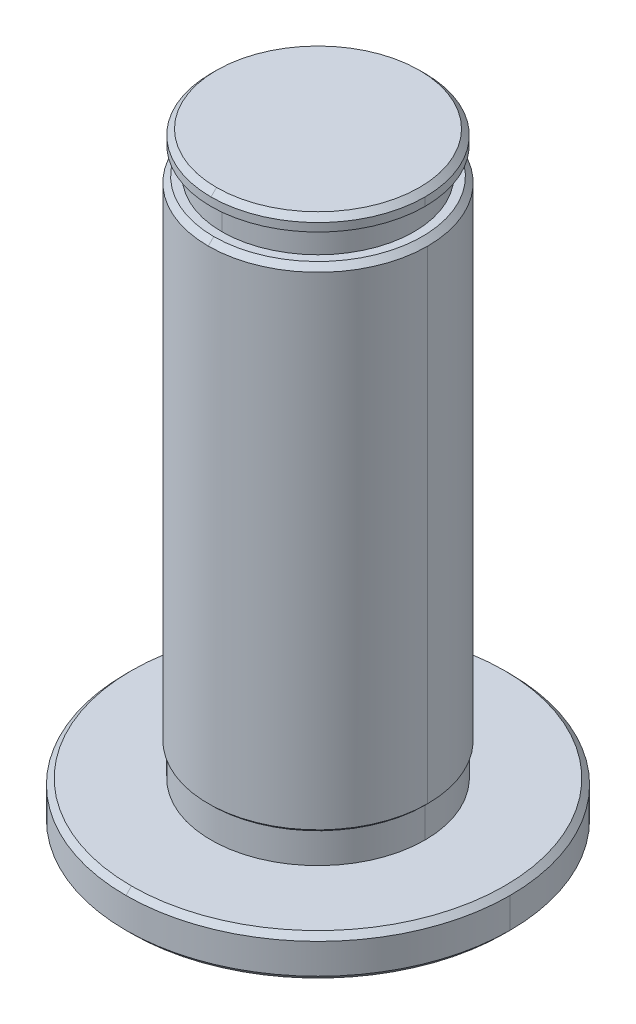
ISO-10303-21;
HEADER;
FILE_DESCRIPTION(('STEP AP214'),'2;1');
FILE_NAME('part.step','',(''),(''),'','','');
FILE_SCHEMA(('AUTOMOTIVE_DESIGN { 1 0 10303 214 1 1 1 1 }'));
ENDSEC;
DATA;
#1=APPLICATION_CONTEXT('core data for automotive mechanical design processes');
#2=APPLICATION_PROTOCOL_DEFINITION('international standard','automotive_design',2000,#1);
#3=PRODUCT_CONTEXT('',#1,'mechanical');
#4=PRODUCT('Part','Part','',(#3));
#5=PRODUCT_RELATED_PRODUCT_CATEGORY('part','',(#4));
#6=PRODUCT_DEFINITION_FORMATION('','',#4);
#7=PRODUCT_DEFINITION_CONTEXT('part definition',#1,'design');
#8=PRODUCT_DEFINITION('design','',#6,#7);
#9=PRODUCT_DEFINITION_SHAPE('','',#8);
#10=(LENGTH_UNIT() NAMED_UNIT(*) SI_UNIT(.MILLI.,.METRE.));
#11=(NAMED_UNIT(*) PLANE_ANGLE_UNIT() SI_UNIT($,.RADIAN.));
#12=(NAMED_UNIT(*) SI_UNIT($,.STERADIAN.) SOLID_ANGLE_UNIT());
#13=UNCERTAINTY_MEASURE_WITH_UNIT(LENGTH_MEASURE(1.E-05),#10,'distance_accuracy_value','');
#14=(GEOMETRIC_REPRESENTATION_CONTEXT(3) GLOBAL_UNCERTAINTY_ASSIGNED_CONTEXT((#13)) GLOBAL_UNIT_ASSIGNED_CONTEXT((#10,
#11,#12)) REPRESENTATION_CONTEXT('',''));
#15=CARTESIAN_POINT('',(0.,0.,0.));
#16=DIRECTION('',(0.,0.,1.));
#17=DIRECTION('',(1.,0.,0.));
#18=AXIS2_PLACEMENT_3D('',#15,#16,#17);
#19=CARTESIAN_POINT('',(0.,22.3999999999,-1.727211490668E-09));
#20=DIRECTION('',(0.,-1.,0.));
#21=DIRECTION('',(0.,0.,-1.));
#22=AXIS2_PLACEMENT_3D('',#19,#20,#21);
#23=CONICAL_SURFACE('',#22,3.800000001147,0.78539816335262);
#24=DIRECTION('',(-1.017767324438E-09,0.707106780865698,-0.707106781507398));
#25=VECTOR('',#24,1.);
#26=CARTESIAN_POINT('',(2.878682977538E-10,22.29999999991,3.899999999601));
#27=LINE('',#26,#25);
#28=CARTESIAN_POINT('',(8.636039379043E-10,22.29999999991,3.899999999401));
#29=VERTEX_POINT('',#28);
#30=CARTESIAN_POINT('',(0.,22.5,3.699999999331));
#31=VERTEX_POINT('',#30);
#32=EDGE_CURVE('E75',#29,#31,#27,.T.);
#33=ORIENTED_EDGE('',*,*,#32,.F.);
#34=CARTESIAN_POINT('',(0.,22.29999999991,-1.727211490668E-09));
#35=DIRECTION('',(0.,-1.,0.));
#36=DIRECTION('',(1.,0.,4.428749861263E-10));
#37=AXIS2_PLACEMENT_3D('',#34,#35,#36);
#38=CIRCLE('',#37,3.900000001129);
#39=CARTESIAN_POINT('',(3.900000000001,22.30000000104,-2.878681292819E-10));
#40=VERTEX_POINT('',#39);
#41=EDGE_CURVE('E79',#40,#29,#38,.T.);
#42=ORIENTED_EDGE('',*,*,#41,.F.);
#43=CARTESIAN_POINT('',(0.,22.30000000216,-1.727211490668E-09));
#44=DIRECTION('',(0.,-1.,0.));
#45=DIRECTION('',(2.214375963056E-10,0.,-1.));
#46=AXIS2_PLACEMENT_3D('',#43,#44,#45);
#47=CIRCLE('',#46,3.899999998878);
#48=CARTESIAN_POINT('',(8.636066253432E-10,22.30000000216,-3.900000000605));
#49=VERTEX_POINT('',#48);
#50=EDGE_CURVE('E104',#49,#40,#47,.T.);
#51=ORIENTED_EDGE('',*,*,#50,.F.);
#52=DIRECTION('',(-1.017769855889E-09,0.707106781575398,0.707106780797698));
#53=VECTOR('',#52,1.);
#54=CARTESIAN_POINT('',(2.878685566616E-10,22.30000000216,-3.900000000403));
#55=LINE('',#54,#53);
#56=CARTESIAN_POINT('',(0.,22.5,-3.700000002785));
#57=VERTEX_POINT('',#56);
#58=EDGE_CURVE('E84',#49,#57,#55,.T.);
#59=ORIENTED_EDGE('',*,*,#58,.T.);
#60=CARTESIAN_POINT('',(0.,22.5,-1.727211490668E-09));
#61=DIRECTION('',(0.,-1.,0.));
#62=DIRECTION('',(0.,0.,-1.));
#63=AXIS2_PLACEMENT_3D('',#60,#61,#62);
#64=CIRCLE('',#63,3.700000001058);
#65=EDGE_CURVE('E9',#57,#31,#64,.T.);
#66=ORIENTED_EDGE('',*,*,#65,.T.);
#67=EDGE_LOOP('',(#33,#42,#51,#59,#66));
#68=FACE_BOUND('',#67,.T.);
#69=ADVANCED_FACE('F15',(#68),#23,.T.);
#70=CARTESIAN_POINT('',(0.,22.5,0.));
#71=DIRECTION('',(0.,1.,0.));
#72=DIRECTION('',(1.,0.,0.));
#73=AXIS2_PLACEMENT_3D('',#70,#71,#72);
#74=PLANE('',#73);
#75=CARTESIAN_POINT('',(0.,22.5,-1.727211490668E-09));
#76=DIRECTION('',(0.,-1.,0.));
#77=DIRECTION('',(0.,0.,1.));
#78=AXIS2_PLACEMENT_3D('',#75,#76,#77);
#79=CIRCLE('',#78,3.700000001058);
#80=EDGE_CURVE('E24',#31,#57,#79,.T.);
#81=ORIENTED_EDGE('',*,*,#80,.F.);
#82=ORIENTED_EDGE('',*,*,#65,.F.);
#83=EDGE_LOOP('',(#81,#82));
#84=FACE_BOUND('',#83,.T.);
#85=ADVANCED_FACE('F502',(#84),#74,.T.);
#86=CARTESIAN_POINT('',(0.,22.3999999999,-1.727211490668E-09));
#87=DIRECTION('',(0.,-1.,0.));
#88=DIRECTION('',(0.,0.,-1.));
#89=AXIS2_PLACEMENT_3D('',#86,#87,#88);
#90=CONICAL_SURFACE('',#89,3.800000001147,0.78539816335262);
#91=ORIENTED_EDGE('',*,*,#58,.F.);
#92=CARTESIAN_POINT('',(0.,22.30000000216,-1.727211490668E-09));
#93=DIRECTION('',(0.,-1.,0.));
#94=DIRECTION('',(-1.,0.,4.427493855751E-10));
#95=AXIS2_PLACEMENT_3D('',#92,#93,#94);
#96=CIRCLE('',#95,3.899999998878);
#97=CARTESIAN_POINT('',(-3.899999998878,22.30000000216,-4.88887422217E-13));
#98=VERTEX_POINT('',#97);
#99=EDGE_CURVE('E89',#98,#49,#96,.T.);
#100=ORIENTED_EDGE('',*,*,#99,.F.);
#101=CARTESIAN_POINT('',(0.,22.29999999991,-1.727211490668E-09));
#102=DIRECTION('',(0.,-1.,0.));
#103=DIRECTION('',(2.214369070909E-10,0.,1.));
#104=AXIS2_PLACEMENT_3D('',#101,#102,#103);
#105=CIRCLE('',#104,3.900000001129);
#106=EDGE_CURVE('E86',#29,#98,#105,.T.);
#107=ORIENTED_EDGE('',*,*,#106,.F.);
#108=ORIENTED_EDGE('',*,*,#32,.T.);
#109=ORIENTED_EDGE('',*,*,#80,.T.);
#110=EDGE_LOOP('',(#91,#100,#107,#108,#109));
#111=FACE_BOUND('',#110,.T.);
#112=ADVANCED_FACE('F87',(#111),#90,.T.);
#113=CARTESIAN_POINT('',(0.,-1.255,0.));
#114=DIRECTION('',(0.,1.,0.));
#115=DIRECTION('',(1.,0.,0.));
#116=AXIS2_PLACEMENT_3D('',#113,#114,#115);
#117=CYLINDRICAL_SURFACE('',#116,3.9);
#118=CARTESIAN_POINT('',(0.,21.99999999967,0.));
#119=DIRECTION('',(0.,1.,0.));
#120=DIRECTION('',(0.,0.,1.));
#121=AXIS2_PLACEMENT_3D('',#118,#119,#120);
#122=CIRCLE('',#121,3.9);
#123=CARTESIAN_POINT('',(0.,21.99999999967,3.9));
#124=VERTEX_POINT('',#123);
#125=CARTESIAN_POINT('',(3.9,21.99999999967,0.));
#126=VERTEX_POINT('',#125);
#127=EDGE_CURVE('E205',#124,#126,#122,.T.);
#128=ORIENTED_EDGE('',*,*,#127,.T.);
#129=DIRECTION('',(-3.367676492695E-12,-1.,9.595613552628E-10));
#130=VECTOR('',#129,1.);
#131=CARTESIAN_POINT('',(3.900000000001,22.30000000104,-2.878681292819E-10));
#132=LINE('',#131,#130);
#133=EDGE_CURVE('E96',#40,#126,#132,.T.);
#134=ORIENTED_EDGE('',*,*,#133,.F.);
#135=ORIENTED_EDGE('',*,*,#41,.T.);
#136=ORIENTED_EDGE('',*,*,#106,.T.);
#137=DIRECTION('',(3.367676492695E-12,-1.,9.595624836255E-10));
#138=VECTOR('',#137,1.);
#139=CARTESIAN_POINT('',(-3.900000000001,22.30000000104,-2.881946312147E-10));
#140=LINE('',#139,#138);
#141=CARTESIAN_POINT('',(-3.9,21.99999999967,0.));
#142=VERTEX_POINT('',#141);
#143=EDGE_CURVE('E172',#98,#142,#140,.T.);
#144=ORIENTED_EDGE('',*,*,#143,.T.);
#145=CARTESIAN_POINT('',(0.,21.99999999967,0.));
#146=DIRECTION('',(0.,1.,0.));
#147=DIRECTION('',(-1.,0.,0.));
#148=AXIS2_PLACEMENT_3D('',#145,#146,#147);
#149=CIRCLE('',#148,3.9);
#150=EDGE_CURVE('E208',#142,#124,#149,.T.);
#151=ORIENTED_EDGE('',*,*,#150,.T.);
#152=EDGE_LOOP('',(#128,#134,#135,#136,#144,#151));
#153=FACE_BOUND('',#152,.T.);
#154=ADVANCED_FACE('F95',(#153),#117,.T.);
#155=CARTESIAN_POINT('',(0.,-1.255,0.));
#156=DIRECTION('',(0.,1.,0.));
#157=DIRECTION('',(1.,0.,0.));
#158=AXIS2_PLACEMENT_3D('',#155,#156,#157);
#159=CYLINDRICAL_SURFACE('',#158,3.9);
#160=ORIENTED_EDGE('',*,*,#143,.F.);
#161=ORIENTED_EDGE('',*,*,#99,.T.);
#162=ORIENTED_EDGE('',*,*,#50,.T.);
#163=ORIENTED_EDGE('',*,*,#133,.T.);
#164=CARTESIAN_POINT('',(0.,21.99999999967,0.));
#165=DIRECTION('',(0.,1.,0.));
#166=DIRECTION('',(1.,0.,0.));
#167=AXIS2_PLACEMENT_3D('',#164,#165,#166);
#168=CIRCLE('',#167,3.9);
#169=CARTESIAN_POINT('',(0.,21.99999999967,-3.9));
#170=VERTEX_POINT('',#169);
#171=EDGE_CURVE('E175',#126,#170,#168,.T.);
#172=ORIENTED_EDGE('',*,*,#171,.T.);
#173=CARTESIAN_POINT('',(0.,21.99999999967,0.));
#174=DIRECTION('',(0.,1.,0.));
#175=DIRECTION('',(0.,0.,-1.));
#176=AXIS2_PLACEMENT_3D('',#173,#174,#175);
#177=CIRCLE('',#176,3.9);
#178=EDGE_CURVE('E211',#170,#142,#177,.T.);
#179=ORIENTED_EDGE('',*,*,#178,.T.);
#180=EDGE_LOOP('',(#160,#161,#162,#163,#172,#179));
#181=FACE_BOUND('',#180,.T.);
#182=ADVANCED_FACE('F513',(#181),#159,.T.);
#183=CARTESIAN_POINT('',(0.,21.99999999967,0.));
#184=DIRECTION('',(0.,-1.,0.));
#185=DIRECTION('',(0.,0.,-1.));
#186=AXIS2_PLACEMENT_3D('',#183,#184,#185);
#187=PLANE('',#186);
#188=CARTESIAN_POINT('',(0.,21.99999999967,-1.64666794966E-09));
#189=DIRECTION('',(0.,-1.,0.));
#190=DIRECTION('',(0.,0.,-1.));
#191=AXIS2_PLACEMENT_3D('',#188,#189,#190);
#192=CIRCLE('',#191,3.500000001647);
#193=CARTESIAN_POINT('',(0.,21.99999999967,-3.500000003294));
#194=VERTEX_POINT('',#193);
#195=CARTESIAN_POINT('',(0.,21.99999999967,3.5));
#196=VERTEX_POINT('',#195);
#197=EDGE_CURVE('E152',#194,#196,#192,.T.);
#198=ORIENTED_EDGE('',*,*,#197,.F.);
#199=CARTESIAN_POINT('',(0.,21.99999999967,-1.64666794966E-09));
#200=DIRECTION('',(0.,-1.,0.));
#201=DIRECTION('',(0.,0.,1.));
#202=AXIS2_PLACEMENT_3D('',#199,#200,#201);
#203=CIRCLE('',#202,3.500000001647);
#204=EDGE_CURVE('E201',#196,#194,#203,.T.);
#205=ORIENTED_EDGE('',*,*,#204,.F.);
#206=EDGE_LOOP('',(#198,#205));
#207=FACE_BOUND('',#206,.T.);
#208=ORIENTED_EDGE('',*,*,#127,.F.);
#209=ORIENTED_EDGE('',*,*,#150,.F.);
#210=ORIENTED_EDGE('',*,*,#178,.F.);
#211=ORIENTED_EDGE('',*,*,#171,.F.);
#212=EDGE_LOOP('',(#208,#209,#210,#211));
#213=FACE_BOUND('',#212,.T.);
#214=ADVANCED_FACE('F336',(#207,#213),#187,.T.);
#215=CARTESIAN_POINT('',(0.,22.5,-1.64666794966E-09));
#216=DIRECTION('',(0.,1.,0.));
#217=DIRECTION('',(0.,0.,1.));
#218=AXIS2_PLACEMENT_3D('',#215,#216,#217);
#219=CYLINDRICAL_SURFACE('',#218,3.500000001647);
#220=DIRECTION('',(0.,-1.,0.));
#221=VECTOR('',#220,1.);
#222=CARTESIAN_POINT('',(0.,21.99999999967,3.5));
#223=LINE('',#222,#221);
#224=CARTESIAN_POINT('',(0.,20.99999999966,3.5));
#225=VERTEX_POINT('',#224);
#226=EDGE_CURVE('E156',#196,#225,#223,.T.);
#227=ORIENTED_EDGE('',*,*,#226,.F.);
#228=ORIENTED_EDGE('',*,*,#204,.T.);
#229=DIRECTION('',(0.,-1.,0.));
#230=VECTOR('',#229,1.);
#231=CARTESIAN_POINT('',(0.,21.99999999967,-3.500000003294));
#232=LINE('',#231,#230);
#233=CARTESIAN_POINT('',(0.,20.99999999966,-3.500000003294));
#234=VERTEX_POINT('',#233);
#235=EDGE_CURVE('E157',#194,#234,#232,.T.);
#236=ORIENTED_EDGE('',*,*,#235,.T.);
#237=CARTESIAN_POINT('',(0.,20.99999999966,-1.64666794966E-09));
#238=DIRECTION('',(0.,1.,0.));
#239=DIRECTION('',(0.,0.,-1.));
#240=AXIS2_PLACEMENT_3D('',#237,#238,#239);
#241=CIRCLE('',#240,3.500000001647);
#242=EDGE_CURVE('E190',#234,#225,#241,.T.);
#243=ORIENTED_EDGE('',*,*,#242,.T.);
#244=EDGE_LOOP('',(#227,#228,#236,#243));
#245=FACE_BOUND('',#244,.T.);
#246=ADVANCED_FACE('F333',(#245),#219,.T.);
#247=CARTESIAN_POINT('',(0.,22.5,-1.64666794966E-09));
#248=DIRECTION('',(0.,1.,0.));
#249=DIRECTION('',(0.,0.,1.));
#250=AXIS2_PLACEMENT_3D('',#247,#248,#249);
#251=CYLINDRICAL_SURFACE('',#250,3.500000001647);
#252=ORIENTED_EDGE('',*,*,#235,.F.);
#253=ORIENTED_EDGE('',*,*,#197,.T.);
#254=ORIENTED_EDGE('',*,*,#226,.T.);
#255=CARTESIAN_POINT('',(0.,20.99999999966,-1.64666794966E-09));
#256=DIRECTION('',(0.,1.,0.));
#257=DIRECTION('',(0.,0.,1.));
#258=AXIS2_PLACEMENT_3D('',#255,#256,#257);
#259=CIRCLE('',#258,3.500000001647);
#260=EDGE_CURVE('E191',#225,#234,#259,.T.);
#261=ORIENTED_EDGE('',*,*,#260,.T.);
#262=EDGE_LOOP('',(#252,#253,#254,#261));
#263=FACE_BOUND('',#262,.T.);
#264=ADVANCED_FACE('F338',(#263),#251,.T.);
#265=CARTESIAN_POINT('',(0.,20.89999999966,0.));
#266=DIRECTION('',(0.,-1.,0.));
#267=DIRECTION('',(0.,0.,-1.));
#268=AXIS2_PLACEMENT_3D('',#265,#266,#267);
#269=CONICAL_SURFACE('',#268,3.90000000001,0.78539816335262);
#270=DIRECTION('',(0.,0.707106781219398,0.707106781153698));
#271=VECTOR('',#270,1.);
#272=CARTESIAN_POINT('',(0.,20.79999999966,-4.));
#273=LINE('',#272,#271);
#274=CARTESIAN_POINT('',(0.,20.79999999966,-4.000000000001));
#275=VERTEX_POINT('',#274);
#276=CARTESIAN_POINT('',(0.,20.99999999966,-3.800000000019));
#277=VERTEX_POINT('',#276);
#278=EDGE_CURVE('E166',#275,#277,#273,.T.);
#279=ORIENTED_EDGE('',*,*,#278,.F.);
#280=CARTESIAN_POINT('',(0.,20.79999999966,0.));
#281=DIRECTION('',(0.,-1.,0.));
#282=DIRECTION('',(-1.,0.,0.));
#283=AXIS2_PLACEMENT_3D('',#280,#281,#282);
#284=CIRCLE('',#283,4.000000000001);
#285=CARTESIAN_POINT('',(-4.000000000001,20.79999999966,0.));
#286=VERTEX_POINT('',#285);
#287=EDGE_CURVE('E171',#286,#275,#284,.T.);
#288=ORIENTED_EDGE('',*,*,#287,.F.);
#289=CARTESIAN_POINT('',(0.,20.79999999966,0.));
#290=DIRECTION('',(0.,-1.,0.));
#291=DIRECTION('',(0.,0.,1.));
#292=AXIS2_PLACEMENT_3D('',#289,#290,#291);
#293=CIRCLE('',#292,4.000000000001);
#294=CARTESIAN_POINT('',(0.,20.79999999966,4.000000000001));
#295=VERTEX_POINT('',#294);
#296=EDGE_CURVE('E151',#295,#286,#293,.T.);
#297=ORIENTED_EDGE('',*,*,#296,.F.);
#298=DIRECTION('',(0.,0.707106781219398,-0.707106781153698));
#299=VECTOR('',#298,1.);
#300=CARTESIAN_POINT('',(0.,20.79999999966,4.));
#301=LINE('',#300,#299);
#302=CARTESIAN_POINT('',(0.,20.99999999966,3.800000000019));
#303=VERTEX_POINT('',#302);
#304=EDGE_CURVE('E162',#295,#303,#301,.T.);
#305=ORIENTED_EDGE('',*,*,#304,.T.);
#306=CARTESIAN_POINT('',(0.,20.99999999966,0.));
#307=DIRECTION('',(0.,-1.,0.));
#308=DIRECTION('',(0.,0.,1.));
#309=AXIS2_PLACEMENT_3D('',#306,#307,#308);
#310=CIRCLE('',#309,3.800000000019);
#311=EDGE_CURVE('E186',#303,#277,#310,.T.);
#312=ORIENTED_EDGE('',*,*,#311,.T.);
#313=EDGE_LOOP('',(#279,#288,#297,#305,#312));
#314=FACE_BOUND('',#313,.T.);
#315=ADVANCED_FACE('F345',(#314),#269,.T.);
#316=CARTESIAN_POINT('',(0.,20.99999999966,0.));
#317=DIRECTION('',(0.,-1.,0.));
#318=DIRECTION('',(0.,0.,-1.));
#319=AXIS2_PLACEMENT_3D('',#316,#317,#318);
#320=PLANE('',#319);
#321=ORIENTED_EDGE('',*,*,#242,.F.);
#322=ORIENTED_EDGE('',*,*,#260,.F.);
#323=EDGE_LOOP('',(#321,#322));
#324=FACE_BOUND('',#323,.T.);
#325=CARTESIAN_POINT('',(0.,20.99999999966,0.));
#326=DIRECTION('',(0.,-1.,0.));
#327=DIRECTION('',(0.,0.,-1.));
#328=AXIS2_PLACEMENT_3D('',#325,#326,#327);
#329=CIRCLE('',#328,3.800000000019);
#330=EDGE_CURVE('E185',#277,#303,#329,.T.);
#331=ORIENTED_EDGE('',*,*,#330,.F.);
#332=ORIENTED_EDGE('',*,*,#311,.F.);
#333=EDGE_LOOP('',(#331,#332));
#334=FACE_BOUND('',#333,.T.);
#335=ADVANCED_FACE('F341',(#324,#334),#320,.F.);
#336=CARTESIAN_POINT('',(0.,20.89999999966,0.));
#337=DIRECTION('',(0.,-1.,0.));
#338=DIRECTION('',(0.,0.,-1.));
#339=AXIS2_PLACEMENT_3D('',#336,#337,#338);
#340=CONICAL_SURFACE('',#339,3.90000000001,0.78539816335262);
#341=ORIENTED_EDGE('',*,*,#304,.F.);
#342=CARTESIAN_POINT('',(0.,20.79999999966,0.));
#343=DIRECTION('',(0.,-1.,0.));
#344=DIRECTION('',(1.,0.,0.));
#345=AXIS2_PLACEMENT_3D('',#342,#343,#344);
#346=CIRCLE('',#345,4.000000000001);
#347=CARTESIAN_POINT('',(4.000000000001,20.79999999966,0.));
#348=VERTEX_POINT('',#347);
#349=EDGE_CURVE('E147',#348,#295,#346,.T.);
#350=ORIENTED_EDGE('',*,*,#349,.F.);
#351=CARTESIAN_POINT('',(0.,20.79999999966,0.));
#352=DIRECTION('',(0.,-1.,0.));
#353=DIRECTION('',(0.,0.,-1.));
#354=AXIS2_PLACEMENT_3D('',#351,#352,#353);
#355=CIRCLE('',#354,4.000000000001);
#356=EDGE_CURVE('E167',#275,#348,#355,.T.);
#357=ORIENTED_EDGE('',*,*,#356,.F.);
#358=ORIENTED_EDGE('',*,*,#278,.T.);
#359=ORIENTED_EDGE('',*,*,#330,.T.);
#360=EDGE_LOOP('',(#341,#350,#357,#358,#359));
#361=FACE_BOUND('',#360,.T.);
#362=ADVANCED_FACE('F344',(#361),#340,.T.);
#363=CARTESIAN_POINT('',(0.,-1.255,0.));
#364=DIRECTION('',(0.,1.,0.));
#365=DIRECTION('',(1.,0.,0.));
#366=AXIS2_PLACEMENT_3D('',#363,#364,#365);
#367=CYLINDRICAL_SURFACE('',#366,4.);
#368=DIRECTION('',(9.139456868173E-12,-1.,7.420884249013E-11));
#369=VECTOR('',#368,1.);
#370=CARTESIAN_POINT('',(-4.,20.79999999966,0.));
#371=LINE('',#370,#369);
#372=CARTESIAN_POINT('',(-4.,3.2,0.));
#373=VERTEX_POINT('',#372);
#374=EDGE_CURVE('E161',#286,#373,#371,.T.);
#375=ORIENTED_EDGE('',*,*,#374,.F.);
#376=ORIENTED_EDGE('',*,*,#287,.T.);
#377=ORIENTED_EDGE('',*,*,#356,.T.);
#378=DIRECTION('',(-9.139456868173E-12,-1.,-7.420879434485E-11));
#379=VECTOR('',#378,1.);
#380=CARTESIAN_POINT('',(4.,20.79999999966,0.));
#381=LINE('',#380,#379);
#382=CARTESIAN_POINT('',(4.,3.2,0.));
#383=VERTEX_POINT('',#382);
#384=EDGE_CURVE('E142',#348,#383,#381,.T.);
#385=ORIENTED_EDGE('',*,*,#384,.T.);
#386=CARTESIAN_POINT('',(0.,3.2,0.));
#387=DIRECTION('',(0.,-1.,0.));
#388=DIRECTION('',(-1.,0.,0.));
#389=AXIS2_PLACEMENT_3D('',#386,#387,#388);
#390=CIRCLE('',#389,4.);
#391=EDGE_CURVE('E133',#373,#383,#390,.T.);
#392=ORIENTED_EDGE('',*,*,#391,.F.);
#393=EDGE_LOOP('',(#375,#376,#377,#385,#392));
#394=FACE_BOUND('',#393,.T.);
#395=ADVANCED_FACE('F364',(#394),#367,.T.);
#396=CARTESIAN_POINT('',(0.,-1.255,0.));
#397=DIRECTION('',(0.,1.,0.));
#398=DIRECTION('',(1.,0.,0.));
#399=AXIS2_PLACEMENT_3D('',#396,#397,#398);
#400=CYLINDRICAL_SURFACE('',#399,4.);
#401=ORIENTED_EDGE('',*,*,#384,.F.);
#402=ORIENTED_EDGE('',*,*,#349,.T.);
#403=ORIENTED_EDGE('',*,*,#296,.T.);
#404=ORIENTED_EDGE('',*,*,#374,.T.);
#405=CARTESIAN_POINT('',(0.,3.2,0.));
#406=DIRECTION('',(0.,-1.,0.));
#407=DIRECTION('',(1.,0.,0.));
#408=AXIS2_PLACEMENT_3D('',#405,#406,#407);
#409=CIRCLE('',#408,4.);
#410=EDGE_CURVE('E143',#383,#373,#409,.T.);
#411=ORIENTED_EDGE('',*,*,#410,.F.);
#412=EDGE_LOOP('',(#401,#402,#403,#404,#411));
#413=FACE_BOUND('',#412,.T.);
#414=ADVANCED_FACE('F359',(#413),#400,.T.);
#415=CARTESIAN_POINT('',(0.,-1.255,0.));
#416=DIRECTION('',(0.,1.,0.));
#417=DIRECTION('',(1.,0.,0.));
#418=AXIS2_PLACEMENT_3D('',#415,#416,#417);
#419=CYLINDRICAL_SURFACE('',#418,3.9);
#420=DIRECTION('',(-1.424198133367E-10,-1.,-1.157659072007E-09));
#421=VECTOR('',#420,1.);
#422=CARTESIAN_POINT('',(-3.899999999843,3.099999999843,1.273424739983E-09));
#423=LINE('',#422,#421);
#424=CARTESIAN_POINT('',(-3.9,3.1,0.));
#425=VERTEX_POINT('',#424);
#426=CARTESIAN_POINT('',(-3.9,2.,0.));
#427=VERTEX_POINT('',#426);
#428=EDGE_CURVE('E121',#425,#427,#423,.T.);
#429=ORIENTED_EDGE('',*,*,#428,.T.);
#430=CARTESIAN_POINT('',(0.,2.,0.));
#431=DIRECTION('',(0.,1.,0.));
#432=DIRECTION('',(-1.,0.,0.));
#433=AXIS2_PLACEMENT_3D('',#430,#431,#432);
#434=CIRCLE('',#433,3.9);
#435=CARTESIAN_POINT('',(3.9,2.,0.));
#436=VERTEX_POINT('',#435);
#437=EDGE_CURVE('E108',#427,#436,#434,.T.);
#438=ORIENTED_EDGE('',*,*,#437,.T.);
#439=DIRECTION('',(1.424198133367E-10,-1.,1.157657694321E-09));
#440=VECTOR('',#439,1.);
#441=CARTESIAN_POINT('',(3.899999999843,3.099999999843,-1.273423224529E-09));
#442=LINE('',#441,#440);
#443=CARTESIAN_POINT('',(3.9,3.1,0.));
#444=VERTEX_POINT('',#443);
#445=EDGE_CURVE('E117',#444,#436,#442,.T.);
#446=ORIENTED_EDGE('',*,*,#445,.F.);
#447=CARTESIAN_POINT('',(0.,3.1,0.));
#448=DIRECTION('',(0.,-1.,0.));
#449=DIRECTION('',(1.,0.,0.));
#450=AXIS2_PLACEMENT_3D('',#447,#448,#449);
#451=CIRCLE('',#450,3.9);
#452=EDGE_CURVE('E138',#444,#425,#451,.T.);
#453=ORIENTED_EDGE('',*,*,#452,.T.);
#454=EDGE_LOOP('',(#429,#438,#446,#453));
#455=FACE_BOUND('',#454,.T.);
#456=ADVANCED_FACE('F276',(#455),#419,.T.);
#457=CARTESIAN_POINT('',(0.,3.1499999998,0.));
#458=DIRECTION('',(0.,1.,0.));
#459=DIRECTION('',(0.,0.,-1.));
#460=AXIS2_PLACEMENT_3D('',#457,#458,#459);
#461=CONICAL_SURFACE('',#460,3.9499999998,0.7853981633973);
#462=DIRECTION('',(0.707106781186597,0.707106781186498,-2.30879634223299E-10));
#463=VECTOR('',#462,1.);
#464=CARTESIAN_POINT('',(3.899999999843,3.099999999843,-1.273423224529E-09));
#465=LINE('',#464,#463);
#466=EDGE_CURVE('E137',#444,#383,#465,.T.);
#467=ORIENTED_EDGE('',*,*,#466,.T.);
#468=ORIENTED_EDGE('',*,*,#410,.T.);
#469=DIRECTION('',(-0.707106781186597,0.707106781186498,2.308760646682E-10));
#470=VECTOR('',#469,1.);
#471=CARTESIAN_POINT('',(-3.899999999843,3.099999999843,1.273424739983E-09));
#472=LINE('',#471,#470);
#473=EDGE_CURVE('E129',#425,#373,#472,.T.);
#474=ORIENTED_EDGE('',*,*,#473,.F.);
#475=ORIENTED_EDGE('',*,*,#452,.F.);
#476=EDGE_LOOP('',(#467,#468,#474,#475));
#477=FACE_BOUND('',#476,.T.);
#478=ADVANCED_FACE('F367',(#477),#461,.T.);
#479=CARTESIAN_POINT('',(0.,3.1499999998,0.));
#480=DIRECTION('',(0.,1.,0.));
#481=DIRECTION('',(0.,0.,-1.));
#482=AXIS2_PLACEMENT_3D('',#479,#480,#481);
#483=CONICAL_SURFACE('',#482,3.9499999998,0.7853981633973);
#484=ORIENTED_EDGE('',*,*,#473,.T.);
#485=ORIENTED_EDGE('',*,*,#391,.T.);
#486=ORIENTED_EDGE('',*,*,#466,.F.);
#487=CARTESIAN_POINT('',(0.,3.1,0.));
#488=DIRECTION('',(0.,-1.,0.));
#489=DIRECTION('',(-1.,0.,0.));
#490=AXIS2_PLACEMENT_3D('',#487,#488,#489);
#491=CIRCLE('',#490,3.9);
#492=EDGE_CURVE('E125',#425,#444,#491,.T.);
#493=ORIENTED_EDGE('',*,*,#492,.F.);
#494=EDGE_LOOP('',(#484,#485,#486,#493));
#495=FACE_BOUND('',#494,.T.);
#496=ADVANCED_FACE('F487',(#495),#483,.T.);
#497=CARTESIAN_POINT('',(0.,-1.255,0.));
#498=DIRECTION('',(0.,1.,0.));
#499=DIRECTION('',(1.,0.,0.));
#500=AXIS2_PLACEMENT_3D('',#497,#498,#499);
#501=CYLINDRICAL_SURFACE('',#500,3.9);
#502=ORIENTED_EDGE('',*,*,#445,.T.);
#503=CARTESIAN_POINT('',(0.,2.,0.));
#504=DIRECTION('',(0.,1.,0.));
#505=DIRECTION('',(1.,0.,0.));
#506=AXIS2_PLACEMENT_3D('',#503,#504,#505);
#507=CIRCLE('',#506,3.9);
#508=EDGE_CURVE('E110',#436,#427,#507,.T.);
#509=ORIENTED_EDGE('',*,*,#508,.T.);
#510=ORIENTED_EDGE('',*,*,#428,.F.);
#511=ORIENTED_EDGE('',*,*,#492,.T.);
#512=EDGE_LOOP('',(#502,#509,#510,#511));
#513=FACE_BOUND('',#512,.T.);
#514=ADVANCED_FACE('F489',(#513),#501,.T.);
#515=CARTESIAN_POINT('',(0.,-1.255,0.));
#516=DIRECTION('',(0.,1.,0.));
#517=DIRECTION('',(1.,0.,0.));
#518=AXIS2_PLACEMENT_3D('',#515,#516,#517);
#519=CYLINDRICAL_SURFACE('',#518,7.);
#520=DIRECTION('',(0.,-1.,0.));
#521=VECTOR('',#520,1.);
#522=CARTESIAN_POINT('',(7.,1.8,0.));
#523=LINE('',#522,#521);
#524=CARTESIAN_POINT('',(7.,1.8,0.));
#525=VERTEX_POINT('',#524);
#526=CARTESIAN_POINT('',(7.,0.7000000000001,0.));
#527=VERTEX_POINT('',#526);
#528=EDGE_CURVE('E255',#525,#527,#523,.T.);
#529=ORIENTED_EDGE('',*,*,#528,.T.);
#530=CARTESIAN_POINT('',(0.,0.7000000000001,0.));
#531=DIRECTION('',(0.,1.,0.));
#532=DIRECTION('',(1.,0.,0.));
#533=AXIS2_PLACEMENT_3D('',#530,#531,#532);
#534=CIRCLE('',#533,7.);
#535=CARTESIAN_POINT('',(0.,0.7000000000001,-7.));
#536=VERTEX_POINT('',#535);
#537=EDGE_CURVE('E231',#527,#536,#534,.T.);
#538=ORIENTED_EDGE('',*,*,#537,.T.);
#539=CARTESIAN_POINT('',(0.,0.7000000000001,0.));
#540=DIRECTION('',(0.,1.,0.));
#541=DIRECTION('',(0.,0.,-1.));
#542=AXIS2_PLACEMENT_3D('',#539,#540,#541);
#543=CIRCLE('',#542,7.);
#544=CARTESIAN_POINT('',(-7.,0.7000000000001,0.));
#545=VERTEX_POINT('',#544);
#546=EDGE_CURVE('E385',#536,#545,#543,.T.);
#547=ORIENTED_EDGE('',*,*,#546,.T.);
#548=DIRECTION('',(0.,-1.,0.));
#549=VECTOR('',#548,1.);
#550=CARTESIAN_POINT('',(-7.,1.8,0.));
#551=LINE('',#550,#549);
#552=CARTESIAN_POINT('',(-7.,1.8,0.));
#553=VERTEX_POINT('',#552);
#554=EDGE_CURVE('E245',#553,#545,#551,.T.);
#555=ORIENTED_EDGE('',*,*,#554,.F.);
#556=CARTESIAN_POINT('',(0.,1.8,0.));
#557=DIRECTION('',(0.,-1.,0.));
#558=DIRECTION('',(-1.,0.,0.));
#559=AXIS2_PLACEMENT_3D('',#556,#557,#558);
#560=CIRCLE('',#559,7.);
#561=CARTESIAN_POINT('',(0.,1.8,-7.));
#562=VERTEX_POINT('',#561);
#563=EDGE_CURVE('E113',#553,#562,#560,.T.);
#564=ORIENTED_EDGE('',*,*,#563,.T.);
#565=CARTESIAN_POINT('',(0.,1.8,0.));
#566=DIRECTION('',(0.,-1.,0.));
#567=DIRECTION('',(0.,0.,-1.));
#568=AXIS2_PLACEMENT_3D('',#565,#566,#567);
#569=CIRCLE('',#568,7.);
#570=EDGE_CURVE('E259',#562,#525,#569,.T.);
#571=ORIENTED_EDGE('',*,*,#570,.T.);
#572=EDGE_LOOP('',(#529,#538,#547,#555,#564,#571));
#573=FACE_BOUND('',#572,.T.);
#574=ADVANCED_FACE('F414',(#573),#519,.T.);
#575=CARTESIAN_POINT('',(0.,1.9,0.));
#576=DIRECTION('',(0.,-1.,0.));
#577=DIRECTION('',(0.,0.,-1.));
#578=AXIS2_PLACEMENT_3D('',#575,#576,#577);
#579=CONICAL_SURFACE('',#578,6.9,0.785398163397125);
#580=DIRECTION('',(0.,0.707106781186598,0.707106781186498));
#581=VECTOR('',#580,1.);
#582=CARTESIAN_POINT('',(0.,1.8,-7.));
#583=LINE('',#582,#581);
#584=CARTESIAN_POINT('',(0.,2.,-6.8));
#585=VERTEX_POINT('',#584);
#586=EDGE_CURVE('E240',#562,#585,#583,.T.);
#587=ORIENTED_EDGE('',*,*,#586,.F.);
#588=ORIENTED_EDGE('',*,*,#563,.F.);
#589=CARTESIAN_POINT('',(0.,1.8,0.));
#590=DIRECTION('',(0.,-1.,0.));
#591=DIRECTION('',(0.,0.,1.));
#592=AXIS2_PLACEMENT_3D('',#589,#590,#591);
#593=CIRCLE('',#592,7.);
#594=CARTESIAN_POINT('',(0.,1.8,7.));
#595=VERTEX_POINT('',#594);
#596=EDGE_CURVE('E241',#595,#553,#593,.T.);
#597=ORIENTED_EDGE('',*,*,#596,.F.);
#598=DIRECTION('',(0.,0.707106781186598,-0.707106781186498));
#599=VECTOR('',#598,1.);
#600=CARTESIAN_POINT('',(0.,1.8,7.));
#601=LINE('',#600,#599);
#602=CARTESIAN_POINT('',(0.,2.,6.8));
#603=VERTEX_POINT('',#602);
#604=EDGE_CURVE('E254',#595,#603,#601,.T.);
#605=ORIENTED_EDGE('',*,*,#604,.T.);
#606=CARTESIAN_POINT('',(0.,2.,0.));
#607=DIRECTION('',(0.,-1.,0.));
#608=DIRECTION('',(0.,0.,1.));
#609=AXIS2_PLACEMENT_3D('',#606,#607,#608);
#610=CIRCLE('',#609,6.8);
#611=EDGE_CURVE('E239',#603,#585,#610,.T.);
#612=ORIENTED_EDGE('',*,*,#611,.T.);
#613=EDGE_LOOP('',(#587,#588,#597,#605,#612));
#614=FACE_BOUND('',#613,.T.);
#615=ADVANCED_FACE('F497',(#614),#579,.T.);
#616=CARTESIAN_POINT('',(0.,2.,0.));
#617=DIRECTION('',(0.,1.,0.));
#618=DIRECTION('',(1.,0.,0.));
#619=AXIS2_PLACEMENT_3D('',#616,#617,#618);
#620=PLANE('',#619);
#621=ORIENTED_EDGE('',*,*,#437,.F.);
#622=ORIENTED_EDGE('',*,*,#508,.F.);
#623=EDGE_LOOP('',(#621,#622));
#624=FACE_BOUND('',#623,.T.);
#625=ORIENTED_EDGE('',*,*,#611,.F.);
#626=CARTESIAN_POINT('',(0.,2.,0.));
#627=DIRECTION('',(0.,-1.,0.));
#628=DIRECTION('',(0.,0.,-1.));
#629=AXIS2_PLACEMENT_3D('',#626,#627,#628);
#630=CIRCLE('',#629,6.8);
#631=EDGE_CURVE('E235',#585,#603,#630,.T.);
#632=ORIENTED_EDGE('',*,*,#631,.F.);
#633=EDGE_LOOP('',(#625,#632));
#634=FACE_BOUND('',#633,.T.);
#635=ADVANCED_FACE('F284',(#624,#634),#620,.T.);
#636=CARTESIAN_POINT('',(0.,1.9,0.));
#637=DIRECTION('',(0.,-1.,0.));
#638=DIRECTION('',(0.,0.,-1.));
#639=AXIS2_PLACEMENT_3D('',#636,#637,#638);
#640=CONICAL_SURFACE('',#639,6.9,0.785398163397125);
#641=ORIENTED_EDGE('',*,*,#604,.F.);
#642=CARTESIAN_POINT('',(0.,1.8,0.));
#643=DIRECTION('',(0.,-1.,0.));
#644=DIRECTION('',(1.,0.,0.));
#645=AXIS2_PLACEMENT_3D('',#642,#643,#644);
#646=CIRCLE('',#645,7.);
#647=EDGE_CURVE('E250',#525,#595,#646,.T.);
#648=ORIENTED_EDGE('',*,*,#647,.F.);
#649=ORIENTED_EDGE('',*,*,#570,.F.);
#650=ORIENTED_EDGE('',*,*,#586,.T.);
#651=ORIENTED_EDGE('',*,*,#631,.T.);
#652=EDGE_LOOP('',(#641,#648,#649,#650,#651));
#653=FACE_BOUND('',#652,.T.);
#654=ADVANCED_FACE('F454',(#653),#640,.T.);
#655=CARTESIAN_POINT('',(0.,-1.255,0.));
#656=DIRECTION('',(0.,1.,0.));
#657=DIRECTION('',(1.,0.,0.));
#658=AXIS2_PLACEMENT_3D('',#655,#656,#657);
#659=CYLINDRICAL_SURFACE('',#658,7.);
#660=ORIENTED_EDGE('',*,*,#596,.T.);
#661=ORIENTED_EDGE('',*,*,#554,.T.);
#662=CARTESIAN_POINT('',(0.,0.7000000000001,0.));
#663=DIRECTION('',(0.,1.,0.));
#664=DIRECTION('',(-1.,0.,0.));
#665=AXIS2_PLACEMENT_3D('',#662,#663,#664);
#666=CIRCLE('',#665,7.);
#667=CARTESIAN_POINT('',(0.,0.7000000000001,7.));
#668=VERTEX_POINT('',#667);
#669=EDGE_CURVE('E382',#545,#668,#666,.T.);
#670=ORIENTED_EDGE('',*,*,#669,.T.);
#671=CARTESIAN_POINT('',(0.,0.7000000000001,0.));
#672=DIRECTION('',(0.,1.,0.));
#673=DIRECTION('',(0.,0.,1.));
#674=AXIS2_PLACEMENT_3D('',#671,#672,#673);
#675=CIRCLE('',#674,7.);
#676=EDGE_CURVE('E246',#668,#527,#675,.T.);
#677=ORIENTED_EDGE('',*,*,#676,.T.);
#678=ORIENTED_EDGE('',*,*,#528,.F.);
#679=ORIENTED_EDGE('',*,*,#647,.T.);
#680=EDGE_LOOP('',(#660,#661,#670,#677,#678,#679));
#681=FACE_BOUND('',#680,.T.);
#682=ADVANCED_FACE('F401',(#681),#659,.T.);
#683=CARTESIAN_POINT('',(0.,0.6000000000001,0.));
#684=DIRECTION('',(0.,1.,0.));
#685=DIRECTION('',(0.,0.,-1.));
#686=AXIS2_PLACEMENT_3D('',#683,#684,#685);
#687=CONICAL_SURFACE('',#686,6.9,0.785398163397125);
#688=DIRECTION('',(0.,-0.707106781186698,0.707106781186398));
#689=VECTOR('',#688,1.);
#690=CARTESIAN_POINT('',(0.,0.7000000000001,-7.));
#691=LINE('',#690,#689);
#692=CARTESIAN_POINT('',(0.,0.5,-6.8));
#693=VERTEX_POINT('',#692);
#694=EDGE_CURVE('E389',#536,#693,#691,.T.);
#695=ORIENTED_EDGE('',*,*,#694,.F.);
#696=ORIENTED_EDGE('',*,*,#537,.F.);
#697=ORIENTED_EDGE('',*,*,#676,.F.);
#698=DIRECTION('',(0.,-0.707106781186698,-0.707106781186398));
#699=VECTOR('',#698,1.);
#700=CARTESIAN_POINT('',(0.,0.7000000000001,7.));
#701=LINE('',#700,#699);
#702=CARTESIAN_POINT('',(0.,0.5,6.8));
#703=VERTEX_POINT('',#702);
#704=EDGE_CURVE('E380',#668,#703,#701,.T.);
#705=ORIENTED_EDGE('',*,*,#704,.T.);
#706=CARTESIAN_POINT('',(0.,0.5,0.));
#707=DIRECTION('',(0.,1.,0.));
#708=DIRECTION('',(0.,0.,1.));
#709=AXIS2_PLACEMENT_3D('',#706,#707,#708);
#710=CIRCLE('',#709,6.8);
#711=EDGE_CURVE('E433',#703,#693,#710,.T.);
#712=ORIENTED_EDGE('',*,*,#711,.T.);
#713=EDGE_LOOP('',(#695,#696,#697,#705,#712));
#714=FACE_BOUND('',#713,.T.);
#715=ADVANCED_FACE('F458',(#714),#687,.T.);
#716=CARTESIAN_POINT('',(0.,0.6000000000001,0.));
#717=DIRECTION('',(0.,1.,0.));
#718=DIRECTION('',(0.,0.,-1.));
#719=AXIS2_PLACEMENT_3D('',#716,#717,#718);
#720=CONICAL_SURFACE('',#719,6.9,0.785398163397125);
#721=ORIENTED_EDGE('',*,*,#704,.F.);
#722=ORIENTED_EDGE('',*,*,#669,.F.);
#723=ORIENTED_EDGE('',*,*,#546,.F.);
#724=ORIENTED_EDGE('',*,*,#694,.T.);
#725=CARTESIAN_POINT('',(0.,0.5,0.));
#726=DIRECTION('',(0.,1.,0.));
#727=DIRECTION('',(0.,0.,-1.));
#728=AXIS2_PLACEMENT_3D('',#725,#726,#727);
#729=CIRCLE('',#728,6.8);
#730=EDGE_CURVE('E423',#693,#703,#729,.T.);
#731=ORIENTED_EDGE('',*,*,#730,.T.);
#732=EDGE_LOOP('',(#721,#722,#723,#724,#731));
#733=FACE_BOUND('',#732,.T.);
#734=ADVANCED_FACE('F418',(#733),#720,.T.);
#735=CARTESIAN_POINT('',(0.,0.5,0.));
#736=DIRECTION('',(0.,1.,0.));
#737=DIRECTION('',(1.,0.,0.));
#738=AXIS2_PLACEMENT_3D('',#735,#736,#737);
#739=PLANE('',#738);
#740=ORIENTED_EDGE('',*,*,#711,.F.);
#741=ORIENTED_EDGE('',*,*,#730,.F.);
#742=EDGE_LOOP('',(#740,#741));
#743=FACE_BOUND('',#742,.T.);
#744=ADVANCED_FACE('F467',(#743),#739,.F.);
#745=CLOSED_SHELL('',(#69,#85,#112,#154,#182,#214,#246,#264,#315,#335,#362,#395,#414,#456,#478,
#496,#514,#574,#615,#635,#654,#682,#715,#734,#744));
#746=MANIFOLD_SOLID_BREP('B1',#745);
#747=ADVANCED_BREP_SHAPE_REPRESENTATION('',(#18,#746),#14);
#748=SHAPE_DEFINITION_REPRESENTATION(#9,#747);
ENDSEC;
END-ISO-10303-21;
